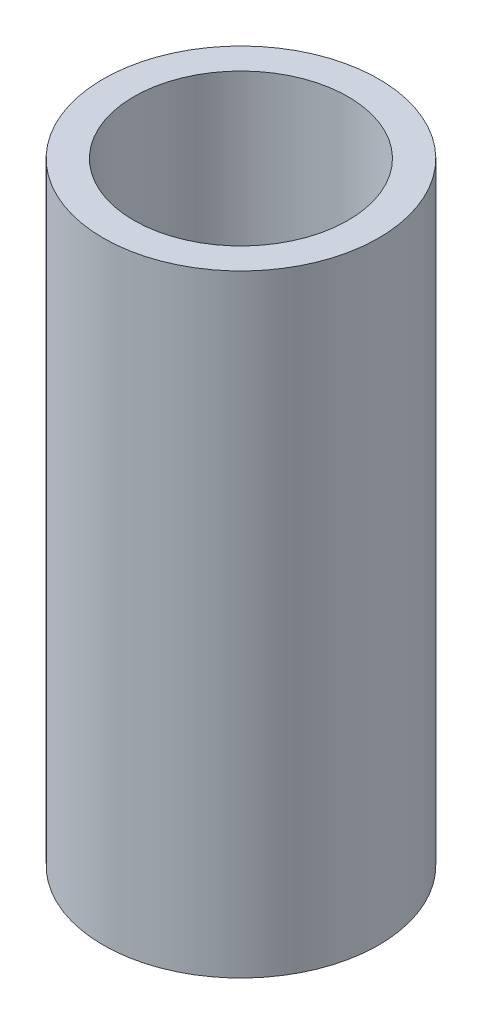
ISO-10303-21;
HEADER;
FILE_DESCRIPTION(('STEP AP214'),'2;1');
FILE_NAME('part.step','',(''),(''),'','','');
FILE_SCHEMA(('AUTOMOTIVE_DESIGN { 1 0 10303 214 1 1 1 1 }'));
ENDSEC;
DATA;
#1=APPLICATION_CONTEXT('core data for automotive mechanical design processes');
#2=APPLICATION_PROTOCOL_DEFINITION('international standard','automotive_design',2000,#1);
#3=PRODUCT_CONTEXT('',#1,'mechanical');
#4=PRODUCT('Part','Part','',(#3));
#5=PRODUCT_RELATED_PRODUCT_CATEGORY('part','',(#4));
#6=PRODUCT_DEFINITION_FORMATION('','',#4);
#7=PRODUCT_DEFINITION_CONTEXT('part definition',#1,'design');
#8=PRODUCT_DEFINITION('design','',#6,#7);
#9=PRODUCT_DEFINITION_SHAPE('','',#8);
#10=(LENGTH_UNIT() NAMED_UNIT(*) SI_UNIT(.MILLI.,.METRE.));
#11=(NAMED_UNIT(*) PLANE_ANGLE_UNIT() SI_UNIT($,.RADIAN.));
#12=(NAMED_UNIT(*) SI_UNIT($,.STERADIAN.) SOLID_ANGLE_UNIT());
#13=UNCERTAINTY_MEASURE_WITH_UNIT(LENGTH_MEASURE(1.E-05),#10,'distance_accuracy_value','');
#14=(GEOMETRIC_REPRESENTATION_CONTEXT(3) GLOBAL_UNCERTAINTY_ASSIGNED_CONTEXT((#13)) GLOBAL_UNIT_ASSIGNED_CONTEXT((#10,
#11,#12)) REPRESENTATION_CONTEXT('',''));
#15=CARTESIAN_POINT('',(0.,0.,0.));
#16=DIRECTION('',(0.,0.,1.));
#17=DIRECTION('',(1.,0.,0.));
#18=AXIS2_PLACEMENT_3D('',#15,#16,#17);
#19=CARTESIAN_POINT('',(0.,20.,0.));
#20=DIRECTION('',(0.,1.,0.));
#21=DIRECTION('',(0.,0.,1.));
#22=AXIS2_PLACEMENT_3D('',#19,#20,#21);
#23=PLANE('',#22);
#24=CARTESIAN_POINT('',(0.,20.,0.));
#25=DIRECTION('',(0.,1.,0.));
#26=DIRECTION('',(0.,0.,1.));
#27=AXIS2_PLACEMENT_3D('',#24,#25,#26);
#28=CIRCLE('',#27,4.5);
#29=CARTESIAN_POINT('',(0.,20.,4.5));
#30=VERTEX_POINT('',#29);
#31=EDGE_CURVE('E10',#30,#30,#28,.T.);
#32=ORIENTED_EDGE('',*,*,#31,.T.);
#33=EDGE_LOOP('',(#32));
#34=FACE_BOUND('',#33,.T.);
#35=CARTESIAN_POINT('',(0.,20.,0.));
#36=DIRECTION('',(0.,1.,0.));
#37=DIRECTION('',(0.,0.,1.));
#38=AXIS2_PLACEMENT_3D('',#35,#36,#37);
#39=CIRCLE('',#38,3.5);
#40=CARTESIAN_POINT('',(0.,20.,3.5));
#41=VERTEX_POINT('',#40);
#42=EDGE_CURVE('E42',#41,#41,#39,.T.);
#43=ORIENTED_EDGE('',*,*,#42,.F.);
#44=EDGE_LOOP('',(#43));
#45=FACE_BOUND('',#44,.T.);
#46=ADVANCED_FACE('F31',(#34,#45),#23,.T.);
#47=CARTESIAN_POINT('',(0.,0.,0.));
#48=DIRECTION('',(0.,1.,0.));
#49=DIRECTION('',(0.,0.,1.));
#50=AXIS2_PLACEMENT_3D('',#47,#48,#49);
#51=PLANE('',#50);
#52=CARTESIAN_POINT('',(0.,0.,0.));
#53=DIRECTION('',(0.,1.,0.));
#54=DIRECTION('',(0.,0.,1.));
#55=AXIS2_PLACEMENT_3D('',#52,#53,#54);
#56=CIRCLE('',#55,4.5);
#57=CARTESIAN_POINT('',(0.,0.,4.5));
#58=VERTEX_POINT('',#57);
#59=EDGE_CURVE('E35',#58,#58,#56,.T.);
#60=ORIENTED_EDGE('',*,*,#59,.F.);
#61=EDGE_LOOP('',(#60));
#62=FACE_BOUND('',#61,.T.);
#63=CARTESIAN_POINT('',(0.,0.,0.));
#64=DIRECTION('',(0.,1.,0.));
#65=DIRECTION('',(0.,0.,1.));
#66=AXIS2_PLACEMENT_3D('',#63,#64,#65);
#67=CIRCLE('',#66,3.5);
#68=CARTESIAN_POINT('',(0.,0.,3.5));
#69=VERTEX_POINT('',#68);
#70=EDGE_CURVE('E44',#69,#69,#67,.T.);
#71=ORIENTED_EDGE('',*,*,#70,.T.);
#72=EDGE_LOOP('',(#71));
#73=FACE_BOUND('',#72,.T.);
#74=ADVANCED_FACE('F54',(#62,#73),#51,.F.);
#75=CARTESIAN_POINT('',(0.,20.,0.));
#76=DIRECTION('',(0.,-1.,0.));
#77=DIRECTION('',(0.,0.,-1.));
#78=AXIS2_PLACEMENT_3D('',#75,#76,#77);
#79=CYLINDRICAL_SURFACE('',#78,4.5);
#80=ORIENTED_EDGE('',*,*,#31,.F.);
#81=EDGE_LOOP('',(#80));
#82=FACE_BOUND('',#81,.T.);
#83=ORIENTED_EDGE('',*,*,#59,.T.);
#84=EDGE_LOOP('',(#83));
#85=FACE_BOUND('',#84,.T.);
#86=ADVANCED_FACE('F33',(#82,#85),#79,.T.);
#87=CARTESIAN_POINT('',(0.,20.,0.));
#88=DIRECTION('',(0.,-1.,0.));
#89=DIRECTION('',(0.,0.,-1.));
#90=AXIS2_PLACEMENT_3D('',#87,#88,#89);
#91=CYLINDRICAL_SURFACE('',#90,3.5);
#92=ORIENTED_EDGE('',*,*,#42,.T.);
#93=EDGE_LOOP('',(#92));
#94=FACE_BOUND('',#93,.T.);
#95=ORIENTED_EDGE('',*,*,#70,.F.);
#96=EDGE_LOOP('',(#95));
#97=FACE_BOUND('',#96,.T.);
#98=ADVANCED_FACE('F50',(#94,#97),#91,.F.);
#99=CLOSED_SHELL('',(#46,#74,#86,#98));
#100=MANIFOLD_SOLID_BREP('B2',#99);
#101=ADVANCED_BREP_SHAPE_REPRESENTATION('',(#18,#100),#14);
#102=SHAPE_DEFINITION_REPRESENTATION(#9,#101);
ENDSEC;
END-ISO-10303-21;
